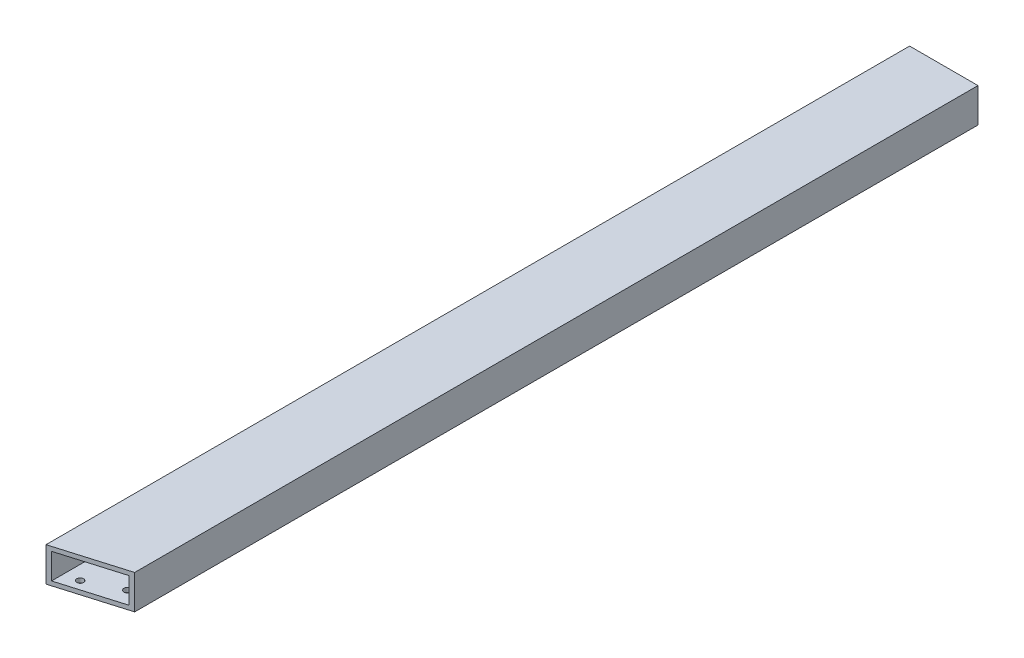
ISO-10303-21;
HEADER;
FILE_DESCRIPTION(('STEP AP214'),'2;1');
FILE_NAME('part.step','',(''),(''),'','','');
FILE_SCHEMA(('AUTOMOTIVE_DESIGN { 1 0 10303 214 1 1 1 1 }'));
ENDSEC;
DATA;
#1=APPLICATION_CONTEXT('core data for automotive mechanical design processes');
#2=APPLICATION_PROTOCOL_DEFINITION('international standard','automotive_design',2000,#1);
#3=PRODUCT_CONTEXT('',#1,'mechanical');
#4=PRODUCT('Part','Part','',(#3));
#5=PRODUCT_RELATED_PRODUCT_CATEGORY('part','',(#4));
#6=PRODUCT_DEFINITION_FORMATION('','',#4);
#7=PRODUCT_DEFINITION_CONTEXT('part definition',#1,'design');
#8=PRODUCT_DEFINITION('design','',#6,#7);
#9=PRODUCT_DEFINITION_SHAPE('','',#8);
#10=(LENGTH_UNIT() NAMED_UNIT(*) SI_UNIT(.MILLI.,.METRE.));
#11=(NAMED_UNIT(*) PLANE_ANGLE_UNIT() SI_UNIT($,.RADIAN.));
#12=(NAMED_UNIT(*) SI_UNIT($,.STERADIAN.) SOLID_ANGLE_UNIT());
#13=UNCERTAINTY_MEASURE_WITH_UNIT(LENGTH_MEASURE(1.E-05),#10,'distance_accuracy_value','');
#14=(GEOMETRIC_REPRESENTATION_CONTEXT(3) GLOBAL_UNCERTAINTY_ASSIGNED_CONTEXT((#13)) GLOBAL_UNIT_ASSIGNED_CONTEXT((#10,
#11,#12)) REPRESENTATION_CONTEXT('',''));
#15=CARTESIAN_POINT('',(0.,0.,0.));
#16=DIRECTION('',(0.,0.,1.));
#17=DIRECTION('',(1.,0.,0.));
#18=AXIS2_PLACEMENT_3D('',#15,#16,#17);
#19=CARTESIAN_POINT('',(-25.4,12.7,320.675));
#20=DIRECTION('',(1.,0.,0.));
#21=DIRECTION('',(0.,0.,-1.));
#22=AXIS2_PLACEMENT_3D('',#19,#20,#21);
#23=PLANE('',#22);
#24=DIRECTION('',(0.,0.,-1.));
#25=VECTOR('',#24,1.);
#26=CARTESIAN_POINT('',(-25.4,12.7,320.675));
#27=LINE('',#26,#25);
#28=CARTESIAN_POINT('',(-25.4,12.7,320.675));
#29=VERTEX_POINT('',#28);
#30=CARTESIAN_POINT('',(-25.4,12.7,-320.675));
#31=VERTEX_POINT('',#30);
#32=EDGE_CURVE('E120',#29,#31,#27,.T.);
#33=ORIENTED_EDGE('',*,*,#32,.T.);
#34=DIRECTION('',(0.,-1.,0.));
#35=VECTOR('',#34,1.);
#36=CARTESIAN_POINT('',(-25.4,12.7,-320.675));
#37=LINE('',#36,#35);
#38=CARTESIAN_POINT('',(-25.4,-12.7,-320.675));
#39=VERTEX_POINT('',#38);
#40=EDGE_CURVE('E193',#31,#39,#37,.T.);
#41=ORIENTED_EDGE('',*,*,#40,.T.);
#42=DIRECTION('',(0.,0.,-1.));
#43=VECTOR('',#42,1.);
#44=CARTESIAN_POINT('',(-25.4,-12.7,320.675));
#45=LINE('',#44,#43);
#46=CARTESIAN_POINT('',(-25.4,-12.7,320.675));
#47=VERTEX_POINT('',#46);
#48=EDGE_CURVE('E52',#47,#39,#45,.T.);
#49=ORIENTED_EDGE('',*,*,#48,.F.);
#50=DIRECTION('',(0.,-1.,0.));
#51=VECTOR('',#50,1.);
#52=CARTESIAN_POINT('',(-25.4,12.7,320.675));
#53=LINE('',#52,#51);
#54=EDGE_CURVE('E112',#29,#47,#53,.T.);
#55=ORIENTED_EDGE('',*,*,#54,.F.);
#56=EDGE_LOOP('',(#33,#41,#49,#55));
#57=FACE_BOUND('',#56,.T.);
#58=ADVANCED_FACE('F43',(#57),#23,.F.);
#59=CARTESIAN_POINT('',(-25.4,-12.7,320.675));
#60=DIRECTION('',(0.,1.,0.));
#61=DIRECTION('',(-1.,0.,0.));
#62=AXIS2_PLACEMENT_3D('',#59,#60,#61);
#63=PLANE('',#62);
#64=CARTESIAN_POINT('',(11.811,-12.7,264.460593775352));
#65=DIRECTION('',(0.,-1.,0.));
#66=DIRECTION('',(0.,0.,-1.));
#67=AXIS2_PLACEMENT_3D('',#64,#65,#66);
#68=CIRCLE('',#67,2.48919999999999);
#69=CARTESIAN_POINT('',(11.811,-12.7,261.971393775353));
#70=VERTEX_POINT('',#69);
#71=EDGE_CURVE('E288',#70,#70,#68,.T.);
#72=ORIENTED_EDGE('',*,*,#71,.F.);
#73=EDGE_LOOP('',(#72));
#74=FACE_BOUND('',#73,.T.);
#75=CARTESIAN_POINT('',(-11.811,-12.7,275.746327933408));
#76=DIRECTION('',(0.,-1.,0.));
#77=DIRECTION('',(0.,0.,-1.));
#78=AXIS2_PLACEMENT_3D('',#75,#76,#77);
#79=CIRCLE('',#78,2.48919999999999);
#80=CARTESIAN_POINT('',(-11.811,-12.7,273.257127933408));
#81=VERTEX_POINT('',#80);
#82=EDGE_CURVE('E281',#81,#81,#79,.T.);
#83=ORIENTED_EDGE('',*,*,#82,.F.);
#84=EDGE_LOOP('',(#83));
#85=FACE_BOUND('',#84,.T.);
#86=CARTESIAN_POINT('',(11.811,-12.7,297.574221755032));
#87=DIRECTION('',(0.,-1.,0.));
#88=DIRECTION('',(0.,0.,-1.));
#89=AXIS2_PLACEMENT_3D('',#86,#87,#88);
#90=CIRCLE('',#89,2.48919999999999);
#91=CARTESIAN_POINT('',(11.811,-12.7,295.085021755032));
#92=VERTEX_POINT('',#91);
#93=EDGE_CURVE('E162',#92,#92,#90,.T.);
#94=ORIENTED_EDGE('',*,*,#93,.F.);
#95=EDGE_LOOP('',(#94));
#96=FACE_BOUND('',#95,.T.);
#97=CARTESIAN_POINT('',(-11.811,-12.7,308.859955913087));
#98=DIRECTION('',(0.,-1.,0.));
#99=DIRECTION('',(0.,0.,-1.));
#100=AXIS2_PLACEMENT_3D('',#97,#98,#99);
#101=CIRCLE('',#100,2.48919999999999);
#102=CARTESIAN_POINT('',(-11.811,-12.7,306.370755913087));
#103=VERTEX_POINT('',#102);
#104=EDGE_CURVE('E148',#103,#103,#101,.T.);
#105=ORIENTED_EDGE('',*,*,#104,.F.);
#106=EDGE_LOOP('',(#105));
#107=FACE_BOUND('',#106,.T.);
#108=DIRECTION('',(0.,0.,-1.));
#109=VECTOR('',#108,1.);
#110=CARTESIAN_POINT('',(25.4,-12.7,320.675));
#111=LINE('',#110,#109);
#112=CARTESIAN_POINT('',(25.4,-12.7,305.627354455926));
#113=VERTEX_POINT('',#112);
#114=CARTESIAN_POINT('',(25.4,-12.7,-320.675));
#115=VERTEX_POINT('',#114);
#116=EDGE_CURVE('E141',#113,#115,#111,.T.);
#117=ORIENTED_EDGE('',*,*,#116,.F.);
#118=DIRECTION('',(-0.958819734868193,0.,0.284015344703924));
#119=VECTOR('',#118,1.);
#120=CARTESIAN_POINT('',(-25.4,-12.7,320.675));
#121=LINE('',#120,#119);
#122=EDGE_CURVE('E117',#113,#47,#121,.T.);
#123=ORIENTED_EDGE('',*,*,#122,.T.);
#124=ORIENTED_EDGE('',*,*,#48,.T.);
#125=DIRECTION('',(1.,0.,0.));
#126=VECTOR('',#125,1.);
#127=CARTESIAN_POINT('',(-25.4,-12.7,-320.675));
#128=LINE('',#127,#126);
#129=EDGE_CURVE('E196',#39,#115,#128,.T.);
#130=ORIENTED_EDGE('',*,*,#129,.T.);
#131=EDGE_LOOP('',(#117,#123,#124,#130));
#132=FACE_BOUND('',#131,.T.);
#133=ADVANCED_FACE('F238',(#74,#85,#96,#107,#132),#63,.F.);
#134=CARTESIAN_POINT('',(25.4,-12.7,320.675));
#135=DIRECTION('',(-1.,0.,0.));
#136=DIRECTION('',(0.,0.,1.));
#137=AXIS2_PLACEMENT_3D('',#134,#135,#136);
#138=PLANE('',#137);
#139=DIRECTION('',(0.,0.,-1.));
#140=VECTOR('',#139,1.);
#141=CARTESIAN_POINT('',(25.4,12.7,320.675));
#142=LINE('',#141,#140);
#143=CARTESIAN_POINT('',(25.4,12.7,305.627354455926));
#144=VERTEX_POINT('',#143);
#145=CARTESIAN_POINT('',(25.4,12.7,-320.675));
#146=VERTEX_POINT('',#145);
#147=EDGE_CURVE('E128',#144,#146,#142,.T.);
#148=ORIENTED_EDGE('',*,*,#147,.F.);
#149=DIRECTION('',(0.,-1.,0.));
#150=VECTOR('',#149,1.);
#151=CARTESIAN_POINT('',(25.4,849.274925158416,305.627354455926));
#152=LINE('',#151,#150);
#153=EDGE_CURVE('E60',#144,#113,#152,.T.);
#154=ORIENTED_EDGE('',*,*,#153,.T.);
#155=ORIENTED_EDGE('',*,*,#116,.T.);
#156=DIRECTION('',(0.,1.,0.));
#157=VECTOR('',#156,1.);
#158=CARTESIAN_POINT('',(25.4,-12.7,-320.675));
#159=LINE('',#158,#157);
#160=EDGE_CURVE('E200',#115,#146,#159,.T.);
#161=ORIENTED_EDGE('',*,*,#160,.T.);
#162=EDGE_LOOP('',(#148,#154,#155,#161));
#163=FACE_BOUND('',#162,.T.);
#164=ADVANCED_FACE('F242',(#163),#138,.F.);
#165=CARTESIAN_POINT('',(25.4,12.7,320.675));
#166=DIRECTION('',(0.,-1.,0.));
#167=DIRECTION('',(1.,0.,0.));
#168=AXIS2_PLACEMENT_3D('',#165,#166,#167);
#169=PLANE('',#168);
#170=ORIENTED_EDGE('',*,*,#32,.F.);
#171=DIRECTION('',(0.958819734868193,0.,-0.284015344703924));
#172=VECTOR('',#171,1.);
#173=CARTESIAN_POINT('',(21.3022324258137,12.7,306.841168510618));
#174=LINE('',#173,#172);
#175=EDGE_CURVE('E108',#29,#144,#174,.T.);
#176=ORIENTED_EDGE('',*,*,#175,.T.);
#177=ORIENTED_EDGE('',*,*,#147,.T.);
#178=DIRECTION('',(-1.,0.,0.));
#179=VECTOR('',#178,1.);
#180=CARTESIAN_POINT('',(25.4,12.7,-320.675));
#181=LINE('',#180,#179);
#182=EDGE_CURVE('E123',#146,#31,#181,.T.);
#183=ORIENTED_EDGE('',*,*,#182,.T.);
#184=EDGE_LOOP('',(#170,#176,#177,#183));
#185=FACE_BOUND('',#184,.T.);
#186=ADVANCED_FACE('F121',(#185),#169,.F.);
#187=CARTESIAN_POINT('',(-22.225,9.525,320.675));
#188=DIRECTION('',(1.,0.,0.));
#189=DIRECTION('',(0.,1.,0.));
#190=AXIS2_PLACEMENT_3D('',#187,#188,#189);
#191=PLANE('',#190);
#192=DIRECTION('',(0.,1.,0.));
#193=VECTOR('',#192,1.);
#194=CARTESIAN_POINT('',(-22.225,9.525,319.734522153495));
#195=LINE('',#194,#193);
#196=CARTESIAN_POINT('',(-22.225,-9.525,319.734522153495));
#197=VERTEX_POINT('',#196);
#198=CARTESIAN_POINT('',(-22.225,9.525,319.734522153495));
#199=VERTEX_POINT('',#198);
#200=EDGE_CURVE('E68',#197,#199,#195,.T.);
#201=ORIENTED_EDGE('',*,*,#200,.F.);
#202=DIRECTION('',(0.,0.,-1.));
#203=VECTOR('',#202,1.);
#204=CARTESIAN_POINT('',(-22.225,-9.525,320.675));
#205=LINE('',#204,#203);
#206=CARTESIAN_POINT('',(-22.225,-9.525,-320.675));
#207=VERTEX_POINT('',#206);
#208=EDGE_CURVE('E132',#197,#207,#205,.T.);
#209=ORIENTED_EDGE('',*,*,#208,.T.);
#210=DIRECTION('',(0.,-1.,0.));
#211=VECTOR('',#210,1.);
#212=CARTESIAN_POINT('',(-22.225,9.525,-320.675));
#213=LINE('',#212,#211);
#214=CARTESIAN_POINT('',(-22.225,9.525,-320.675));
#215=VERTEX_POINT('',#214);
#216=EDGE_CURVE('E177',#215,#207,#213,.T.);
#217=ORIENTED_EDGE('',*,*,#216,.F.);
#218=DIRECTION('',(0.,0.,-1.));
#219=VECTOR('',#218,1.);
#220=CARTESIAN_POINT('',(-22.225,9.525,320.675));
#221=LINE('',#220,#219);
#222=EDGE_CURVE('E206',#199,#215,#221,.T.);
#223=ORIENTED_EDGE('',*,*,#222,.F.);
#224=EDGE_LOOP('',(#201,#209,#217,#223));
#225=FACE_BOUND('',#224,.T.);
#226=ADVANCED_FACE('F225',(#225),#191,.T.);
#227=CARTESIAN_POINT('',(-22.225,-9.525,320.675));
#228=DIRECTION('',(0.,1.,0.));
#229=DIRECTION('',(0.,0.,1.));
#230=AXIS2_PLACEMENT_3D('',#227,#228,#229);
#231=PLANE('',#230);
#232=CARTESIAN_POINT('',(11.811,-9.525,264.460593775352));
#233=DIRECTION('',(0.,1.,0.));
#234=DIRECTION('',(0.,0.,1.));
#235=AXIS2_PLACEMENT_3D('',#232,#233,#234);
#236=CIRCLE('',#235,2.48919999999999);
#237=CARTESIAN_POINT('',(11.811,-9.525,266.949793775352));
#238=VERTEX_POINT('',#237);
#239=EDGE_CURVE('E263',#238,#238,#236,.T.);
#240=ORIENTED_EDGE('',*,*,#239,.F.);
#241=EDGE_LOOP('',(#240));
#242=FACE_BOUND('',#241,.T.);
#243=CARTESIAN_POINT('',(-11.811,-9.525,275.746327933408));
#244=DIRECTION('',(0.,1.,0.));
#245=DIRECTION('',(0.,0.,1.));
#246=AXIS2_PLACEMENT_3D('',#243,#244,#245);
#247=CIRCLE('',#246,2.48919999999999);
#248=CARTESIAN_POINT('',(-11.811,-9.525,278.235527933408));
#249=VERTEX_POINT('',#248);
#250=EDGE_CURVE('E46',#249,#249,#247,.T.);
#251=ORIENTED_EDGE('',*,*,#250,.F.);
#252=EDGE_LOOP('',(#251));
#253=FACE_BOUND('',#252,.T.);
#254=CARTESIAN_POINT('',(11.811,-9.525,297.574221755032));
#255=DIRECTION('',(0.,1.,0.));
#256=DIRECTION('',(0.,0.,1.));
#257=AXIS2_PLACEMENT_3D('',#254,#255,#256);
#258=CIRCLE('',#257,2.48919999999999);
#259=CARTESIAN_POINT('',(11.811,-9.525,300.063421755032));
#260=VERTEX_POINT('',#259);
#261=EDGE_CURVE('E156',#260,#260,#258,.T.);
#262=ORIENTED_EDGE('',*,*,#261,.F.);
#263=EDGE_LOOP('',(#262));
#264=FACE_BOUND('',#263,.T.);
#265=CARTESIAN_POINT('',(-11.811,-9.525,308.859955913087));
#266=DIRECTION('',(0.,1.,0.));
#267=DIRECTION('',(0.,0.,1.));
#268=AXIS2_PLACEMENT_3D('',#265,#266,#267);
#269=CIRCLE('',#268,2.48919999999999);
#270=CARTESIAN_POINT('',(-11.811,-9.525,311.349155913087));
#271=VERTEX_POINT('',#270);
#272=EDGE_CURVE('E145',#271,#271,#269,.T.);
#273=ORIENTED_EDGE('',*,*,#272,.F.);
#274=EDGE_LOOP('',(#273));
#275=FACE_BOUND('',#274,.T.);
#276=DIRECTION('',(-0.958819734868193,0.,0.284015344703924));
#277=VECTOR('',#276,1.);
#278=CARTESIAN_POINT('',(-22.4811104733866,-9.525,319.810385531914));
#279=LINE('',#278,#277);
#280=CARTESIAN_POINT('',(22.225,-9.525,306.567832302431));
#281=VERTEX_POINT('',#280);
#282=EDGE_CURVE('E169',#281,#197,#279,.T.);
#283=ORIENTED_EDGE('',*,*,#282,.F.);
#284=DIRECTION('',(0.,0.,-1.));
#285=VECTOR('',#284,1.);
#286=CARTESIAN_POINT('',(22.225,-9.525,320.675));
#287=LINE('',#286,#285);
#288=CARTESIAN_POINT('',(22.225,-9.525,-320.675));
#289=VERTEX_POINT('',#288);
#290=EDGE_CURVE('E135',#281,#289,#287,.T.);
#291=ORIENTED_EDGE('',*,*,#290,.T.);
#292=DIRECTION('',(1.,0.,0.));
#293=VECTOR('',#292,1.);
#294=CARTESIAN_POINT('',(-22.225,-9.525,-320.675));
#295=LINE('',#294,#293);
#296=EDGE_CURVE('E181',#207,#289,#295,.T.);
#297=ORIENTED_EDGE('',*,*,#296,.F.);
#298=ORIENTED_EDGE('',*,*,#208,.F.);
#299=EDGE_LOOP('',(#283,#291,#297,#298));
#300=FACE_BOUND('',#299,.T.);
#301=ADVANCED_FACE('F216',(#242,#253,#264,#275,#300),#231,.T.);
#302=CARTESIAN_POINT('',(22.225,-9.525,320.675));
#303=DIRECTION('',(-1.,0.,0.));
#304=DIRECTION('',(0.,-1.,0.));
#305=AXIS2_PLACEMENT_3D('',#302,#303,#304);
#306=PLANE('',#305);
#307=DIRECTION('',(0.,-1.,0.));
#308=VECTOR('',#307,1.);
#309=CARTESIAN_POINT('',(22.225,-9.525,306.567832302431));
#310=LINE('',#309,#308);
#311=CARTESIAN_POINT('',(22.225,9.525,306.567832302431));
#312=VERTEX_POINT('',#311);
#313=EDGE_CURVE('E153',#312,#281,#310,.T.);
#314=ORIENTED_EDGE('',*,*,#313,.F.);
#315=DIRECTION('',(0.,0.,-1.));
#316=VECTOR('',#315,1.);
#317=CARTESIAN_POINT('',(22.225,9.525,320.675));
#318=LINE('',#317,#316);
#319=CARTESIAN_POINT('',(22.225,9.525,-320.675));
#320=VERTEX_POINT('',#319);
#321=EDGE_CURVE('E209',#312,#320,#318,.T.);
#322=ORIENTED_EDGE('',*,*,#321,.T.);
#323=DIRECTION('',(0.,1.,0.));
#324=VECTOR('',#323,1.);
#325=CARTESIAN_POINT('',(22.225,-9.525,-320.675));
#326=LINE('',#325,#324);
#327=EDGE_CURVE('E185',#289,#320,#326,.T.);
#328=ORIENTED_EDGE('',*,*,#327,.F.);
#329=ORIENTED_EDGE('',*,*,#290,.F.);
#330=EDGE_LOOP('',(#314,#322,#328,#329));
#331=FACE_BOUND('',#330,.T.);
#332=ADVANCED_FACE('F219',(#331),#306,.T.);
#333=CARTESIAN_POINT('',(22.225,9.525,320.675));
#334=DIRECTION('',(0.,-1.,0.));
#335=DIRECTION('',(0.,0.,-1.));
#336=AXIS2_PLACEMENT_3D('',#333,#334,#335);
#337=PLANE('',#336);
#338=DIRECTION('',(0.958819734868193,0.,-0.284015344703924));
#339=VECTOR('',#338,1.);
#340=CARTESIAN_POINT('',(18.3833428992004,9.525,307.705782978705));
#341=LINE('',#340,#339);
#342=EDGE_CURVE('E11',#199,#312,#341,.T.);
#343=ORIENTED_EDGE('',*,*,#342,.F.);
#344=ORIENTED_EDGE('',*,*,#222,.T.);
#345=DIRECTION('',(-1.,0.,0.));
#346=VECTOR('',#345,1.);
#347=CARTESIAN_POINT('',(22.225,9.525,-320.675));
#348=LINE('',#347,#346);
#349=EDGE_CURVE('E189',#320,#215,#348,.T.);
#350=ORIENTED_EDGE('',*,*,#349,.F.);
#351=ORIENTED_EDGE('',*,*,#321,.F.);
#352=EDGE_LOOP('',(#343,#344,#350,#351));
#353=FACE_BOUND('',#352,.T.);
#354=ADVANCED_FACE('F228',(#353),#337,.T.);
#355=CARTESIAN_POINT('',(0.,0.,-320.675));
#356=DIRECTION('',(0.,0.,1.));
#357=DIRECTION('',(1.,0.,0.));
#358=AXIS2_PLACEMENT_3D('',#355,#356,#357);
#359=PLANE('',#358);
#360=ORIENTED_EDGE('',*,*,#349,.T.);
#361=ORIENTED_EDGE('',*,*,#216,.T.);
#362=ORIENTED_EDGE('',*,*,#296,.T.);
#363=ORIENTED_EDGE('',*,*,#327,.T.);
#364=EDGE_LOOP('',(#360,#361,#362,#363));
#365=FACE_BOUND('',#364,.T.);
#366=ORIENTED_EDGE('',*,*,#40,.F.);
#367=ORIENTED_EDGE('',*,*,#182,.F.);
#368=ORIENTED_EDGE('',*,*,#160,.F.);
#369=ORIENTED_EDGE('',*,*,#129,.F.);
#370=EDGE_LOOP('',(#366,#367,#368,#369));
#371=FACE_BOUND('',#370,.T.);
#372=ADVANCED_FACE('F222',(#365,#371),#359,.F.);
#373=CARTESIAN_POINT('',(-25.4,849.274925158416,320.675));
#374=DIRECTION('',(-0.284015344703924,0.,-0.958819734868193));
#375=DIRECTION('',(-0.958819734868193,0.,0.284015344703924));
#376=AXIS2_PLACEMENT_3D('',#373,#374,#375);
#377=PLANE('',#376);
#378=ORIENTED_EDGE('',*,*,#282,.T.);
#379=ORIENTED_EDGE('',*,*,#200,.T.);
#380=ORIENTED_EDGE('',*,*,#342,.T.);
#381=ORIENTED_EDGE('',*,*,#313,.T.);
#382=EDGE_LOOP('',(#378,#379,#380,#381));
#383=FACE_BOUND('',#382,.T.);
#384=ORIENTED_EDGE('',*,*,#122,.F.);
#385=ORIENTED_EDGE('',*,*,#153,.F.);
#386=ORIENTED_EDGE('',*,*,#175,.F.);
#387=ORIENTED_EDGE('',*,*,#54,.T.);
#388=EDGE_LOOP('',(#384,#385,#386,#387));
#389=FACE_BOUND('',#388,.T.);
#390=ADVANCED_FACE('F110',(#383,#389),#377,.F.);
#391=CARTESIAN_POINT('',(-11.811,-12.7,308.859955913087));
#392=DIRECTION('',(0.,-1.,0.));
#393=DIRECTION('',(0.,0.,-1.));
#394=AXIS2_PLACEMENT_3D('',#391,#392,#393);
#395=CYLINDRICAL_SURFACE('',#394,2.48919999999999);
#396=ORIENTED_EDGE('',*,*,#272,.T.);
#397=EDGE_LOOP('',(#396));
#398=FACE_BOUND('',#397,.T.);
#399=ORIENTED_EDGE('',*,*,#104,.T.);
#400=EDGE_LOOP('',(#399));
#401=FACE_BOUND('',#400,.T.);
#402=ADVANCED_FACE('F274',(#398,#401),#395,.F.);
#403=CARTESIAN_POINT('',(11.811,-12.7,297.574221755032));
#404=DIRECTION('',(0.,-1.,0.));
#405=DIRECTION('',(0.,0.,-1.));
#406=AXIS2_PLACEMENT_3D('',#403,#404,#405);
#407=CYLINDRICAL_SURFACE('',#406,2.48919999999999);
#408=ORIENTED_EDGE('',*,*,#261,.T.);
#409=EDGE_LOOP('',(#408));
#410=FACE_BOUND('',#409,.T.);
#411=ORIENTED_EDGE('',*,*,#93,.T.);
#412=EDGE_LOOP('',(#411));
#413=FACE_BOUND('',#412,.T.);
#414=ADVANCED_FACE('F270',(#410,#413),#407,.F.);
#415=CARTESIAN_POINT('',(-11.811,-12.7,275.746327933408));
#416=DIRECTION('',(0.,-1.,0.));
#417=DIRECTION('',(0.,0.,-1.));
#418=AXIS2_PLACEMENT_3D('',#415,#416,#417);
#419=CYLINDRICAL_SURFACE('',#418,2.48919999999999);
#420=ORIENTED_EDGE('',*,*,#250,.T.);
#421=EDGE_LOOP('',(#420));
#422=FACE_BOUND('',#421,.T.);
#423=ORIENTED_EDGE('',*,*,#82,.T.);
#424=EDGE_LOOP('',(#423));
#425=FACE_BOUND('',#424,.T.);
#426=ADVANCED_FACE('F273',(#422,#425),#419,.F.);
#427=CARTESIAN_POINT('',(11.811,-12.7,264.460593775352));
#428=DIRECTION('',(0.,-1.,0.));
#429=DIRECTION('',(0.,0.,-1.));
#430=AXIS2_PLACEMENT_3D('',#427,#428,#429);
#431=CYLINDRICAL_SURFACE('',#430,2.48919999999999);
#432=ORIENTED_EDGE('',*,*,#239,.T.);
#433=EDGE_LOOP('',(#432));
#434=FACE_BOUND('',#433,.T.);
#435=ORIENTED_EDGE('',*,*,#71,.T.);
#436=EDGE_LOOP('',(#435));
#437=FACE_BOUND('',#436,.T.);
#438=ADVANCED_FACE('F292',(#434,#437),#431,.F.);
#439=CLOSED_SHELL('',(#58,#133,#164,#186,#226,#301,#332,#354,#372,#390,#402,#414,#426,#438));
#440=MANIFOLD_SOLID_BREP('B2',#439);
#441=ADVANCED_BREP_SHAPE_REPRESENTATION('',(#18,#440),#14);
#442=SHAPE_DEFINITION_REPRESENTATION(#9,#441);
ENDSEC;
END-ISO-10303-21;
